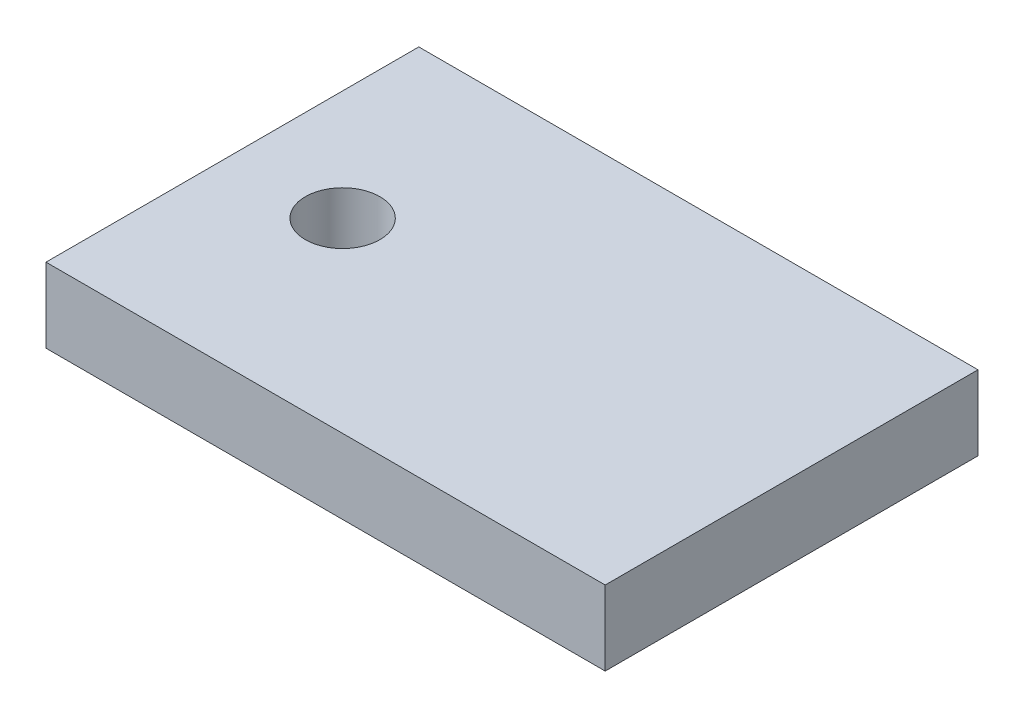
ISO-10303-21;
HEADER;
FILE_DESCRIPTION(('STEP AP214'),'2;1');
FILE_NAME('part.step','',(''),(''),'','','');
FILE_SCHEMA(('AUTOMOTIVE_DESIGN { 1 0 10303 214 1 1 1 1 }'));
ENDSEC;
DATA;
#1=APPLICATION_CONTEXT('core data for automotive mechanical design processes');
#2=APPLICATION_PROTOCOL_DEFINITION('international standard','automotive_design',2000,#1);
#3=PRODUCT_CONTEXT('',#1,'mechanical');
#4=PRODUCT('Part','Part','',(#3));
#5=PRODUCT_RELATED_PRODUCT_CATEGORY('part','',(#4));
#6=PRODUCT_DEFINITION_FORMATION('','',#4);
#7=PRODUCT_DEFINITION_CONTEXT('part definition',#1,'design');
#8=PRODUCT_DEFINITION('design','',#6,#7);
#9=PRODUCT_DEFINITION_SHAPE('','',#8);
#10=(LENGTH_UNIT() NAMED_UNIT(*) SI_UNIT(.MILLI.,.METRE.));
#11=(NAMED_UNIT(*) PLANE_ANGLE_UNIT() SI_UNIT($,.RADIAN.));
#12=(NAMED_UNIT(*) SI_UNIT($,.STERADIAN.) SOLID_ANGLE_UNIT());
#13=UNCERTAINTY_MEASURE_WITH_UNIT(LENGTH_MEASURE(1.E-05),#10,'distance_accuracy_value','');
#14=(GEOMETRIC_REPRESENTATION_CONTEXT(3) GLOBAL_UNCERTAINTY_ASSIGNED_CONTEXT((#13)) GLOBAL_UNIT_ASSIGNED_CONTEXT((#10,
#11,#12)) REPRESENTATION_CONTEXT('',''));
#15=CARTESIAN_POINT('',(0.,0.,0.));
#16=DIRECTION('',(0.,0.,1.));
#17=DIRECTION('',(1.,0.,0.));
#18=AXIS2_PLACEMENT_3D('',#15,#16,#17);
#19=CARTESIAN_POINT('',(45.,0.,0.));
#20=DIRECTION('',(0.,0.,-1.));
#21=DIRECTION('',(0.,1.,0.));
#22=AXIS2_PLACEMENT_3D('',#19,#20,#21);
#23=PLANE('',#22);
#24=DIRECTION('',(0.,-1.,0.));
#25=VECTOR('',#24,1.);
#26=CARTESIAN_POINT('',(0.,0.,0.));
#27=LINE('',#26,#25);
#28=CARTESIAN_POINT('',(0.,0.,0.));
#29=VERTEX_POINT('',#28);
#30=CARTESIAN_POINT('',(0.,-6.,0.));
#31=VERTEX_POINT('',#30);
#32=EDGE_CURVE('E96',#29,#31,#27,.T.);
#33=ORIENTED_EDGE('',*,*,#32,.T.);
#34=DIRECTION('',(-1.,0.,0.));
#35=VECTOR('',#34,1.);
#36=CARTESIAN_POINT('',(45.,-6.,0.));
#37=LINE('',#36,#35);
#38=CARTESIAN_POINT('',(45.,-6.,0.));
#39=VERTEX_POINT('',#38);
#40=EDGE_CURVE('E11',#39,#31,#37,.T.);
#41=ORIENTED_EDGE('',*,*,#40,.F.);
#42=DIRECTION('',(0.,-1.,0.));
#43=VECTOR('',#42,1.);
#44=CARTESIAN_POINT('',(45.,0.,0.));
#45=LINE('',#44,#43);
#46=CARTESIAN_POINT('',(45.,0.,0.));
#47=VERTEX_POINT('',#46);
#48=EDGE_CURVE('E84',#47,#39,#45,.T.);
#49=ORIENTED_EDGE('',*,*,#48,.F.);
#50=DIRECTION('',(-1.,0.,0.));
#51=VECTOR('',#50,1.);
#52=CARTESIAN_POINT('',(45.,0.,0.));
#53=LINE('',#52,#51);
#54=EDGE_CURVE('E92',#47,#29,#53,.T.);
#55=ORIENTED_EDGE('',*,*,#54,.T.);
#56=EDGE_LOOP('',(#33,#41,#49,#55));
#57=FACE_BOUND('',#56,.T.);
#58=ADVANCED_FACE('F33',(#57),#23,.F.);
#59=CARTESIAN_POINT('',(45.,-6.,0.));
#60=DIRECTION('',(0.,1.,0.));
#61=DIRECTION('',(0.,0.,1.));
#62=AXIS2_PLACEMENT_3D('',#59,#60,#61);
#63=PLANE('',#62);
#64=CARTESIAN_POINT('',(8.86993336982875,-6.,-14.9999994918353));
#65=DIRECTION('',(0.,1.,0.));
#66=DIRECTION('',(0.,0.,1.));
#67=AXIS2_PLACEMENT_3D('',#64,#65,#66);
#68=CIRCLE('',#67,3.);
#69=CARTESIAN_POINT('',(8.86993336982875,-6.,-11.9999994918353));
#70=VERTEX_POINT('',#69);
#71=EDGE_CURVE('E99',#70,#70,#68,.T.);
#72=ORIENTED_EDGE('',*,*,#71,.T.);
#73=EDGE_LOOP('',(#72));
#74=FACE_BOUND('',#73,.T.);
#75=DIRECTION('',(0.,0.,-1.));
#76=VECTOR('',#75,1.);
#77=CARTESIAN_POINT('',(0.,-6.,0.));
#78=LINE('',#77,#76);
#79=CARTESIAN_POINT('',(0.,-6.,-30.));
#80=VERTEX_POINT('',#79);
#81=EDGE_CURVE('E88',#31,#80,#78,.T.);
#82=ORIENTED_EDGE('',*,*,#81,.T.);
#83=DIRECTION('',(-1.,0.,0.));
#84=VECTOR('',#83,1.);
#85=CARTESIAN_POINT('',(45.,-6.,-30.));
#86=LINE('',#85,#84);
#87=CARTESIAN_POINT('',(45.,-6.,-30.));
#88=VERTEX_POINT('',#87);
#89=EDGE_CURVE('E41',#88,#80,#86,.T.);
#90=ORIENTED_EDGE('',*,*,#89,.F.);
#91=DIRECTION('',(0.,0.,-1.));
#92=VECTOR('',#91,1.);
#93=CARTESIAN_POINT('',(45.,-6.,0.));
#94=LINE('',#93,#92);
#95=EDGE_CURVE('E79',#39,#88,#94,.T.);
#96=ORIENTED_EDGE('',*,*,#95,.F.);
#97=ORIENTED_EDGE('',*,*,#40,.T.);
#98=EDGE_LOOP('',(#82,#90,#96,#97));
#99=FACE_BOUND('',#98,.T.);
#100=ADVANCED_FACE('F87',(#74,#99),#63,.F.);
#101=CARTESIAN_POINT('',(45.,0.,-30.));
#102=DIRECTION('',(0.,0.,1.));
#103=DIRECTION('',(1.,0.,0.));
#104=AXIS2_PLACEMENT_3D('',#101,#102,#103);
#105=PLANE('',#104);
#106=DIRECTION('',(0.,1.,0.));
#107=VECTOR('',#106,1.);
#108=CARTESIAN_POINT('',(0.,0.,-30.));
#109=LINE('',#108,#107);
#110=CARTESIAN_POINT('',(0.,0.,-30.));
#111=VERTEX_POINT('',#110);
#112=EDGE_CURVE('E66',#80,#111,#109,.T.);
#113=ORIENTED_EDGE('',*,*,#112,.T.);
#114=DIRECTION('',(-1.,0.,0.));
#115=VECTOR('',#114,1.);
#116=CARTESIAN_POINT('',(45.,0.,-30.));
#117=LINE('',#116,#115);
#118=CARTESIAN_POINT('',(45.,0.,-30.));
#119=VERTEX_POINT('',#118);
#120=EDGE_CURVE('E89',#119,#111,#117,.T.);
#121=ORIENTED_EDGE('',*,*,#120,.F.);
#122=DIRECTION('',(0.,1.,0.));
#123=VECTOR('',#122,1.);
#124=CARTESIAN_POINT('',(45.,0.,-30.));
#125=LINE('',#124,#123);
#126=EDGE_CURVE('E82',#88,#119,#125,.T.);
#127=ORIENTED_EDGE('',*,*,#126,.F.);
#128=ORIENTED_EDGE('',*,*,#89,.T.);
#129=EDGE_LOOP('',(#113,#121,#127,#128));
#130=FACE_BOUND('',#129,.T.);
#131=ADVANCED_FACE('F90',(#130),#105,.F.);
#132=CARTESIAN_POINT('',(45.,0.,0.));
#133=DIRECTION('',(0.,-1.,0.));
#134=DIRECTION('',(0.,0.,-1.));
#135=AXIS2_PLACEMENT_3D('',#132,#133,#134);
#136=PLANE('',#135);
#137=CARTESIAN_POINT('',(8.86993336982875,0.,-14.9999994918353));
#138=DIRECTION('',(0.,1.,0.));
#139=DIRECTION('',(0.,0.,1.));
#140=AXIS2_PLACEMENT_3D('',#137,#138,#139);
#141=CIRCLE('',#140,3.);
#142=CARTESIAN_POINT('',(8.86993336982875,0.,-11.9999994918353));
#143=VERTEX_POINT('',#142);
#144=EDGE_CURVE('E110',#143,#143,#141,.T.);
#145=ORIENTED_EDGE('',*,*,#144,.F.);
#146=EDGE_LOOP('',(#145));
#147=FACE_BOUND('',#146,.T.);
#148=DIRECTION('',(0.,0.,1.));
#149=VECTOR('',#148,1.);
#150=CARTESIAN_POINT('',(0.,0.,0.));
#151=LINE('',#150,#149);
#152=EDGE_CURVE('E72',#111,#29,#151,.T.);
#153=ORIENTED_EDGE('',*,*,#152,.T.);
#154=ORIENTED_EDGE('',*,*,#54,.F.);
#155=DIRECTION('',(0.,0.,1.));
#156=VECTOR('',#155,1.);
#157=CARTESIAN_POINT('',(45.,0.,0.));
#158=LINE('',#157,#156);
#159=EDGE_CURVE('E49',#119,#47,#158,.T.);
#160=ORIENTED_EDGE('',*,*,#159,.F.);
#161=ORIENTED_EDGE('',*,*,#120,.T.);
#162=EDGE_LOOP('',(#153,#154,#160,#161));
#163=FACE_BOUND('',#162,.T.);
#164=ADVANCED_FACE('F104',(#147,#163),#136,.F.);
#165=CARTESIAN_POINT('',(45.,-6.,0.));
#166=DIRECTION('',(1.,0.,0.));
#167=DIRECTION('',(0.,0.,-1.));
#168=AXIS2_PLACEMENT_3D('',#165,#166,#167);
#169=PLANE('',#168);
#170=ORIENTED_EDGE('',*,*,#48,.T.);
#171=ORIENTED_EDGE('',*,*,#95,.T.);
#172=ORIENTED_EDGE('',*,*,#126,.T.);
#173=ORIENTED_EDGE('',*,*,#159,.T.);
#174=EDGE_LOOP('',(#170,#171,#172,#173));
#175=FACE_BOUND('',#174,.T.);
#176=ADVANCED_FACE('F80',(#175),#169,.T.);
#177=CARTESIAN_POINT('',(0.,-6.,0.));
#178=DIRECTION('',(1.,0.,0.));
#179=DIRECTION('',(0.,0.,-1.));
#180=AXIS2_PLACEMENT_3D('',#177,#178,#179);
#181=PLANE('',#180);
#182=ORIENTED_EDGE('',*,*,#32,.F.);
#183=ORIENTED_EDGE('',*,*,#152,.F.);
#184=ORIENTED_EDGE('',*,*,#112,.F.);
#185=ORIENTED_EDGE('',*,*,#81,.F.);
#186=EDGE_LOOP('',(#182,#183,#184,#185));
#187=FACE_BOUND('',#186,.T.);
#188=ADVANCED_FACE('F107',(#187),#181,.F.);
#189=CARTESIAN_POINT('',(8.86993336982875,-6.,-14.9999994918353));
#190=DIRECTION('',(0.,1.,0.));
#191=DIRECTION('',(0.,0.,1.));
#192=AXIS2_PLACEMENT_3D('',#189,#190,#191);
#193=CYLINDRICAL_SURFACE('',#192,3.);
#194=ORIENTED_EDGE('',*,*,#71,.F.);
#195=EDGE_LOOP('',(#194));
#196=FACE_BOUND('',#195,.T.);
#197=ORIENTED_EDGE('',*,*,#144,.T.);
#198=EDGE_LOOP('',(#197));
#199=FACE_BOUND('',#198,.T.);
#200=ADVANCED_FACE('F117',(#196,#199),#193,.F.);
#201=CLOSED_SHELL('',(#58,#100,#131,#164,#176,#188,#200));
#202=MANIFOLD_SOLID_BREP('B2',#201);
#203=ADVANCED_BREP_SHAPE_REPRESENTATION('',(#18,#202),#14);
#204=SHAPE_DEFINITION_REPRESENTATION(#9,#203);
ENDSEC;
END-ISO-10303-21;
